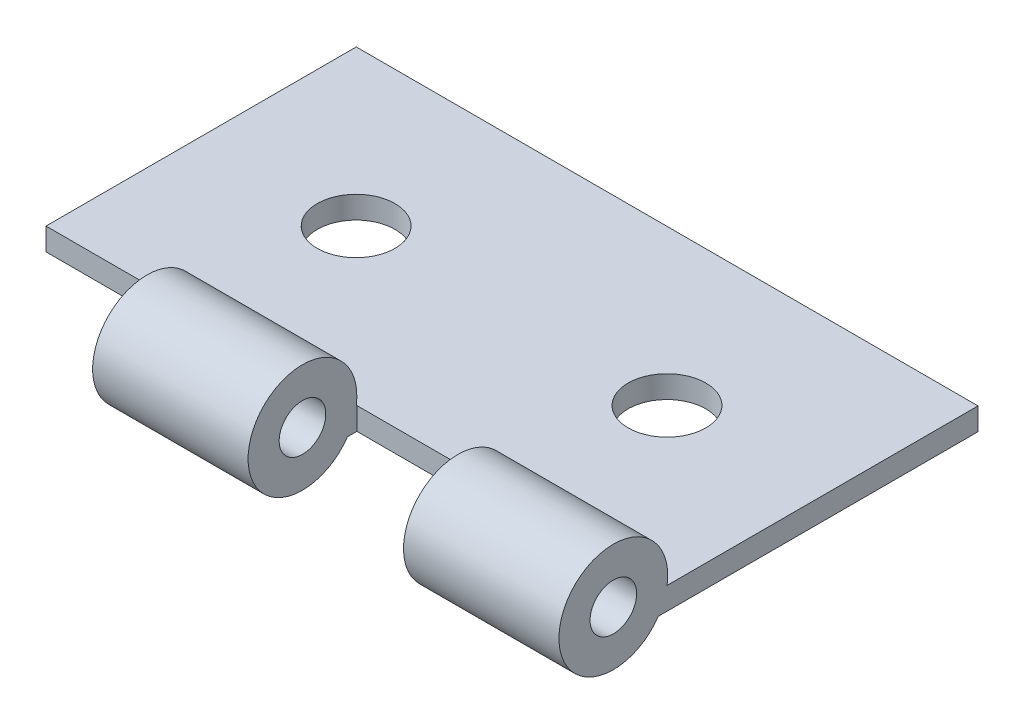
ISO-10303-21;
HEADER;
FILE_DESCRIPTION(('STEP AP214'),'2;1');
FILE_NAME('part.step','',(''),(''),'','','');
FILE_SCHEMA(('AUTOMOTIVE_DESIGN { 1 0 10303 214 1 1 1 1 }'));
ENDSEC;
DATA;
#1=APPLICATION_CONTEXT('core data for automotive mechanical design processes');
#2=APPLICATION_PROTOCOL_DEFINITION('international standard','automotive_design',2000,#1);
#3=PRODUCT_CONTEXT('',#1,'mechanical');
#4=PRODUCT('Part','Part','',(#3));
#5=PRODUCT_RELATED_PRODUCT_CATEGORY('part','',(#4));
#6=PRODUCT_DEFINITION_FORMATION('','',#4);
#7=PRODUCT_DEFINITION_CONTEXT('part definition',#1,'design');
#8=PRODUCT_DEFINITION('design','',#6,#7);
#9=PRODUCT_DEFINITION_SHAPE('','',#8);
#10=(LENGTH_UNIT() NAMED_UNIT(*) SI_UNIT(.MILLI.,.METRE.));
#11=(NAMED_UNIT(*) PLANE_ANGLE_UNIT() SI_UNIT($,.RADIAN.));
#12=(NAMED_UNIT(*) SI_UNIT($,.STERADIAN.) SOLID_ANGLE_UNIT());
#13=UNCERTAINTY_MEASURE_WITH_UNIT(LENGTH_MEASURE(1.E-05),#10,'distance_accuracy_value','');
#14=(GEOMETRIC_REPRESENTATION_CONTEXT(3) GLOBAL_UNCERTAINTY_ASSIGNED_CONTEXT((#13)) GLOBAL_UNIT_ASSIGNED_CONTEXT((#10,
#11,#12)) REPRESENTATION_CONTEXT('',''));
#15=CARTESIAN_POINT('',(0.,0.,0.));
#16=DIRECTION('',(0.,0.,1.));
#17=DIRECTION('',(1.,0.,0.));
#18=AXIS2_PLACEMENT_3D('',#15,#16,#17);
#19=CARTESIAN_POINT('',(50.8,0.,0.));
#20=DIRECTION('',(-1.,0.,0.));
#21=DIRECTION('',(0.,0.,1.));
#22=AXIS2_PLACEMENT_3D('',#19,#20,#21);
#23=CYLINDRICAL_SURFACE('',#22,4.445);
#24=DIRECTION('',(-1.,0.,0.));
#25=VECTOR('',#24,1.);
#26=CARTESIAN_POINT('',(50.8,-0.670981472408734,-4.39406518655381));
#27=LINE('',#26,#25);
#28=CARTESIAN_POINT('',(25.4,-0.670981472408734,-4.39406518655381));
#29=VERTEX_POINT('',#28);
#30=CARTESIAN_POINT('',(12.7,-0.670981472408734,-4.39406518655381));
#31=VERTEX_POINT('',#30);
#32=EDGE_CURVE('E155',#29,#31,#27,.T.);
#33=ORIENTED_EDGE('',*,*,#32,.T.);
#34=CARTESIAN_POINT('',(12.7,0.,0.));
#35=DIRECTION('',(1.,0.,0.));
#36=DIRECTION('',(0.,0.,-1.));
#37=AXIS2_PLACEMENT_3D('',#34,#35,#36);
#38=CIRCLE('',#37,4.445);
#39=CARTESIAN_POINT('',(12.7,-2.49978147240873,-3.67547515162353));
#40=VERTEX_POINT('',#39);
#41=EDGE_CURVE('E133',#31,#40,#38,.T.);
#42=ORIENTED_EDGE('',*,*,#41,.T.);
#43=DIRECTION('',(-1.,0.,0.));
#44=VECTOR('',#43,1.);
#45=CARTESIAN_POINT('',(50.8,-2.49978147240873,-3.67547515162353));
#46=LINE('',#45,#44);
#47=CARTESIAN_POINT('',(25.4,-2.49978147240873,-3.67547515162353));
#48=VERTEX_POINT('',#47);
#49=EDGE_CURVE('E131',#48,#40,#46,.T.);
#50=ORIENTED_EDGE('',*,*,#49,.F.);
#51=CARTESIAN_POINT('',(25.4,0.,0.));
#52=DIRECTION('',(-1.,0.,0.));
#53=DIRECTION('',(0.,0.,1.));
#54=AXIS2_PLACEMENT_3D('',#51,#52,#53);
#55=CIRCLE('',#54,4.445);
#56=EDGE_CURVE('E325',#48,#29,#55,.T.);
#57=ORIENTED_EDGE('',*,*,#56,.T.);
#58=EDGE_LOOP('',(#33,#42,#50,#57));
#59=FACE_BOUND('',#58,.T.);
#60=ADVANCED_FACE('F35',(#59),#23,.T.);
#61=CARTESIAN_POINT('',(50.8,0.,0.));
#62=DIRECTION('',(-1.,0.,0.));
#63=DIRECTION('',(0.,0.,1.));
#64=AXIS2_PLACEMENT_3D('',#61,#62,#63);
#65=CYLINDRICAL_SURFACE('',#64,1.905);
#66=CARTESIAN_POINT('',(38.1,0.,0.));
#67=DIRECTION('',(1.,0.,0.));
#68=DIRECTION('',(0.,0.,-1.));
#69=AXIS2_PLACEMENT_3D('',#66,#67,#68);
#70=CIRCLE('',#69,1.905);
#71=CARTESIAN_POINT('',(38.1,0.,-1.905));
#72=VERTEX_POINT('',#71);
#73=EDGE_CURVE('E138',#72,#72,#70,.T.);
#74=ORIENTED_EDGE('',*,*,#73,.F.);
#75=EDGE_LOOP('',(#74));
#76=FACE_BOUND('',#75,.T.);
#77=CARTESIAN_POINT('',(50.8,0.,0.));
#78=DIRECTION('',(1.,0.,0.));
#79=DIRECTION('',(0.,0.,-1.));
#80=AXIS2_PLACEMENT_3D('',#77,#78,#79);
#81=CIRCLE('',#80,1.905);
#82=CARTESIAN_POINT('',(50.8,0.,-1.905));
#83=VERTEX_POINT('',#82);
#84=EDGE_CURVE('E142',#83,#83,#81,.T.);
#85=ORIENTED_EDGE('',*,*,#84,.T.);
#86=EDGE_LOOP('',(#85));
#87=FACE_BOUND('',#86,.T.);
#88=ADVANCED_FACE('F213',(#76,#87),#65,.F.);
#89=CARTESIAN_POINT('',(50.8,-0.670981472408734,-4.39406518655381));
#90=VERTEX_POINT('',#89);
#91=CARTESIAN_POINT('',(38.1,-0.670981472408734,-4.39406518655381));
#92=VERTEX_POINT('',#91);
#93=EDGE_CURVE('E161',#90,#92,#27,.T.);
#94=ORIENTED_EDGE('',*,*,#93,.T.);
#95=CARTESIAN_POINT('',(38.1,0.,0.));
#96=DIRECTION('',(1.,0.,0.));
#97=DIRECTION('',(0.,0.,-1.));
#98=AXIS2_PLACEMENT_3D('',#95,#96,#97);
#99=CIRCLE('',#98,4.445);
#100=CARTESIAN_POINT('',(38.1,-2.49978147240873,-3.67547515162353));
#101=VERTEX_POINT('',#100);
#102=EDGE_CURVE('E190',#92,#101,#99,.T.);
#103=ORIENTED_EDGE('',*,*,#102,.T.);
#104=CARTESIAN_POINT('',(50.8,-2.49978147240873,-3.67547515162353));
#105=VERTEX_POINT('',#104);
#106=EDGE_CURVE('E170',#105,#101,#46,.T.);
#107=ORIENTED_EDGE('',*,*,#106,.F.);
#108=CARTESIAN_POINT('',(50.8,0.,0.));
#109=DIRECTION('',(1.,0.,0.));
#110=DIRECTION('',(0.,0.,-1.));
#111=AXIS2_PLACEMENT_3D('',#108,#109,#110);
#112=CIRCLE('',#111,4.445);
#113=EDGE_CURVE('E145',#90,#105,#112,.T.);
#114=ORIENTED_EDGE('',*,*,#113,.F.);
#115=EDGE_LOOP('',(#94,#103,#107,#114));
#116=FACE_BOUND('',#115,.T.);
#117=ADVANCED_FACE('F188',(#116),#23,.T.);
#118=CARTESIAN_POINT('',(50.8,-2.49978147240873,0.));
#119=DIRECTION('',(0.,1.,0.));
#120=DIRECTION('',(0.,0.,1.));
#121=AXIS2_PLACEMENT_3D('',#118,#119,#120);
#122=PLANE('',#121);
#123=CARTESIAN_POINT('',(12.6633298013245,-2.49978147240873,-17.1195325932769));
#124=DIRECTION('',(0.,1.,0.));
#125=DIRECTION('',(0.,0.,1.));
#126=AXIS2_PLACEMENT_3D('',#123,#124,#125);
#127=CIRCLE('',#126,3.175);
#128=CARTESIAN_POINT('',(12.6633298013245,-2.49978147240873,-13.9445325932769));
#129=VERTEX_POINT('',#128);
#130=EDGE_CURVE('E340',#129,#129,#127,.T.);
#131=ORIENTED_EDGE('',*,*,#130,.T.);
#132=EDGE_LOOP('',(#131));
#133=FACE_BOUND('',#132,.T.);
#134=CARTESIAN_POINT('',(38.0633298013245,-2.49978147240873,-17.1195325932769));
#135=DIRECTION('',(0.,1.,0.));
#136=DIRECTION('',(0.,0.,1.));
#137=AXIS2_PLACEMENT_3D('',#134,#135,#136);
#138=CIRCLE('',#137,3.175);
#139=CARTESIAN_POINT('',(38.0633298013245,-2.49978147240873,-13.9445325932769));
#140=VERTEX_POINT('',#139);
#141=EDGE_CURVE('E345',#140,#140,#138,.T.);
#142=ORIENTED_EDGE('',*,*,#141,.T.);
#143=EDGE_LOOP('',(#142));
#144=FACE_BOUND('',#143,.T.);
#145=DIRECTION('',(0.,0.,-1.));
#146=VECTOR('',#145,1.);
#147=CARTESIAN_POINT('',(12.7,-2.49978147240873,0.));
#148=LINE('',#147,#146);
#149=CARTESIAN_POINT('',(12.7,-2.49978147240873,-4.445));
#150=VERTEX_POINT('',#149);
#151=EDGE_CURVE('E123',#40,#150,#148,.T.);
#152=ORIENTED_EDGE('',*,*,#151,.T.);
#153=DIRECTION('',(-1.,0.,0.));
#154=VECTOR('',#153,1.);
#155=CARTESIAN_POINT('',(50.8,-2.49978147240873,-4.445));
#156=LINE('',#155,#154);
#157=CARTESIAN_POINT('',(0.,-2.49978147240873,-4.445));
#158=VERTEX_POINT('',#157);
#159=EDGE_CURVE('E111',#150,#158,#156,.T.);
#160=ORIENTED_EDGE('',*,*,#159,.T.);
#161=DIRECTION('',(0.,0.,-1.));
#162=VECTOR('',#161,1.);
#163=CARTESIAN_POINT('',(0.,-2.49978147240873,0.));
#164=LINE('',#163,#162);
#165=CARTESIAN_POINT('',(0.,-2.49978147240873,-29.7940651865538));
#166=VERTEX_POINT('',#165);
#167=EDGE_CURVE('E136',#158,#166,#164,.T.);
#168=ORIENTED_EDGE('',*,*,#167,.T.);
#169=DIRECTION('',(-1.,0.,0.));
#170=VECTOR('',#169,1.);
#171=CARTESIAN_POINT('',(50.8,-2.49978147240873,-29.7940651865538));
#172=LINE('',#171,#170);
#173=CARTESIAN_POINT('',(50.8,-2.49978147240873,-29.7940651865538));
#174=VERTEX_POINT('',#173);
#175=EDGE_CURVE('E167',#174,#166,#172,.T.);
#176=ORIENTED_EDGE('',*,*,#175,.F.);
#177=DIRECTION('',(0.,0.,-1.));
#178=VECTOR('',#177,1.);
#179=CARTESIAN_POINT('',(50.8,-2.49978147240873,0.));
#180=LINE('',#179,#178);
#181=EDGE_CURVE('E149',#105,#174,#180,.T.);
#182=ORIENTED_EDGE('',*,*,#181,.F.);
#183=ORIENTED_EDGE('',*,*,#106,.T.);
#184=DIRECTION('',(0.,0.,-1.));
#185=VECTOR('',#184,1.);
#186=CARTESIAN_POINT('',(38.1,-2.49978147240873,0.));
#187=LINE('',#186,#185);
#188=CARTESIAN_POINT('',(38.1,-2.49978147240873,-4.445));
#189=VERTEX_POINT('',#188);
#190=EDGE_CURVE('E323',#101,#189,#187,.T.);
#191=ORIENTED_EDGE('',*,*,#190,.T.);
#192=DIRECTION('',(-1.,0.,0.));
#193=VECTOR('',#192,1.);
#194=CARTESIAN_POINT('',(50.8,-2.49978147240873,-4.445));
#195=LINE('',#194,#193);
#196=CARTESIAN_POINT('',(25.4,-2.49978147240873,-4.445));
#197=VERTEX_POINT('',#196);
#198=EDGE_CURVE('E119',#189,#197,#195,.T.);
#199=ORIENTED_EDGE('',*,*,#198,.T.);
#200=DIRECTION('',(0.,0.,1.));
#201=VECTOR('',#200,1.);
#202=CARTESIAN_POINT('',(25.4,-2.49978147240873,0.));
#203=LINE('',#202,#201);
#204=EDGE_CURVE('E321',#197,#48,#203,.T.);
#205=ORIENTED_EDGE('',*,*,#204,.T.);
#206=ORIENTED_EDGE('',*,*,#49,.T.);
#207=EDGE_LOOP('',(#152,#160,#168,#176,#182,#183,#191,#199,#205,#206));
#208=FACE_BOUND('',#207,.T.);
#209=ADVANCED_FACE('F128',(#133,#144,#208),#122,.F.);
#210=CARTESIAN_POINT('',(50.8,0.,-29.7940651865538));
#211=DIRECTION('',(0.,0.,1.));
#212=DIRECTION('',(1.,0.,0.));
#213=AXIS2_PLACEMENT_3D('',#210,#211,#212);
#214=PLANE('',#213);
#215=DIRECTION('',(0.,1.,0.));
#216=VECTOR('',#215,1.);
#217=CARTESIAN_POINT('',(0.,0.,-29.7940651865538));
#218=LINE('',#217,#216);
#219=CARTESIAN_POINT('',(0.,-0.670981472408731,-29.7940651865538));
#220=VERTEX_POINT('',#219);
#221=EDGE_CURVE('E157',#166,#220,#218,.T.);
#222=ORIENTED_EDGE('',*,*,#221,.T.);
#223=DIRECTION('',(-1.,0.,0.));
#224=VECTOR('',#223,1.);
#225=CARTESIAN_POINT('',(50.8,-0.670981472408731,-29.7940651865538));
#226=LINE('',#225,#224);
#227=CARTESIAN_POINT('',(50.8,-0.670981472408731,-29.7940651865538));
#228=VERTEX_POINT('',#227);
#229=EDGE_CURVE('E164',#228,#220,#226,.T.);
#230=ORIENTED_EDGE('',*,*,#229,.F.);
#231=DIRECTION('',(0.,1.,0.));
#232=VECTOR('',#231,1.);
#233=CARTESIAN_POINT('',(50.8,0.,-29.7940651865538));
#234=LINE('',#233,#232);
#235=EDGE_CURVE('E151',#174,#228,#234,.T.);
#236=ORIENTED_EDGE('',*,*,#235,.F.);
#237=ORIENTED_EDGE('',*,*,#175,.T.);
#238=EDGE_LOOP('',(#222,#230,#236,#237));
#239=FACE_BOUND('',#238,.T.);
#240=ADVANCED_FACE('F201',(#239),#214,.F.);
#241=CARTESIAN_POINT('',(50.8,-0.670981472408734,0.));
#242=DIRECTION('',(0.,-1.,0.));
#243=DIRECTION('',(0.,0.,-1.));
#244=AXIS2_PLACEMENT_3D('',#241,#242,#243);
#245=PLANE('',#244);
#246=CARTESIAN_POINT('',(12.6633298013245,-0.670981472408732,-17.1195325932769));
#247=DIRECTION('',(0.,1.,0.));
#248=DIRECTION('',(0.,0.,1.));
#249=AXIS2_PLACEMENT_3D('',#246,#247,#248);
#250=CIRCLE('',#249,3.175);
#251=CARTESIAN_POINT('',(12.6633298013245,-0.670981472408733,-13.9445325932769));
#252=VERTEX_POINT('',#251);
#253=EDGE_CURVE('E348',#252,#252,#250,.T.);
#254=ORIENTED_EDGE('',*,*,#253,.F.);
#255=EDGE_LOOP('',(#254));
#256=FACE_BOUND('',#255,.T.);
#257=CARTESIAN_POINT('',(38.0633298013245,-0.670981472408732,-17.1195325932769));
#258=DIRECTION('',(0.,1.,0.));
#259=DIRECTION('',(0.,0.,-1.));
#260=AXIS2_PLACEMENT_3D('',#257,#258,#259);
#261=CIRCLE('',#260,3.175);
#262=CARTESIAN_POINT('',(38.0633298013245,-0.670981472408732,-20.2945325932769));
#263=VERTEX_POINT('',#262);
#264=EDGE_CURVE('E349',#263,#263,#261,.T.);
#265=ORIENTED_EDGE('',*,*,#264,.F.);
#266=EDGE_LOOP('',(#265));
#267=FACE_BOUND('',#266,.T.);
#268=DIRECTION('',(0.,0.,1.));
#269=VECTOR('',#268,1.);
#270=CARTESIAN_POINT('',(0.,-0.670981472408734,0.));
#271=LINE('',#270,#269);
#272=CARTESIAN_POINT('',(0.,-0.670981472408734,-4.445));
#273=VERTEX_POINT('',#272);
#274=EDGE_CURVE('E146',#220,#273,#271,.T.);
#275=ORIENTED_EDGE('',*,*,#274,.T.);
#276=DIRECTION('',(1.,0.,0.));
#277=VECTOR('',#276,1.);
#278=CARTESIAN_POINT('',(50.8,-0.670981472408734,-4.445));
#279=LINE('',#278,#277);
#280=CARTESIAN_POINT('',(12.7,-0.670981472408734,-4.445));
#281=VERTEX_POINT('',#280);
#282=EDGE_CURVE('E58',#273,#281,#279,.T.);
#283=ORIENTED_EDGE('',*,*,#282,.T.);
#284=DIRECTION('',(0.,0.,1.));
#285=VECTOR('',#284,1.);
#286=CARTESIAN_POINT('',(12.7,-0.670981472408734,0.));
#287=LINE('',#286,#285);
#288=EDGE_CURVE('E11',#281,#31,#287,.T.);
#289=ORIENTED_EDGE('',*,*,#288,.T.);
#290=ORIENTED_EDGE('',*,*,#32,.F.);
#291=DIRECTION('',(0.,0.,-1.));
#292=VECTOR('',#291,1.);
#293=CARTESIAN_POINT('',(25.4,-0.670981472408734,0.));
#294=LINE('',#293,#292);
#295=CARTESIAN_POINT('',(25.4,-0.670981472408734,-4.445));
#296=VERTEX_POINT('',#295);
#297=EDGE_CURVE('E177',#29,#296,#294,.T.);
#298=ORIENTED_EDGE('',*,*,#297,.T.);
#299=DIRECTION('',(1.,0.,0.));
#300=VECTOR('',#299,1.);
#301=CARTESIAN_POINT('',(50.8,-0.670981472408734,-4.445));
#302=LINE('',#301,#300);
#303=CARTESIAN_POINT('',(38.1,-0.670981472408734,-4.445));
#304=VERTEX_POINT('',#303);
#305=EDGE_CURVE('E174',#296,#304,#302,.T.);
#306=ORIENTED_EDGE('',*,*,#305,.T.);
#307=DIRECTION('',(0.,0.,1.));
#308=VECTOR('',#307,1.);
#309=CARTESIAN_POINT('',(38.1,-0.670981472408734,0.));
#310=LINE('',#309,#308);
#311=EDGE_CURVE('E43',#304,#92,#310,.T.);
#312=ORIENTED_EDGE('',*,*,#311,.T.);
#313=ORIENTED_EDGE('',*,*,#93,.F.);
#314=DIRECTION('',(0.,0.,1.));
#315=VECTOR('',#314,1.);
#316=CARTESIAN_POINT('',(50.8,-0.670981472408734,0.));
#317=LINE('',#316,#315);
#318=EDGE_CURVE('E153',#228,#90,#317,.T.);
#319=ORIENTED_EDGE('',*,*,#318,.F.);
#320=ORIENTED_EDGE('',*,*,#229,.T.);
#321=EDGE_LOOP('',(#275,#283,#289,#290,#298,#306,#312,#313,#319,#320));
#322=FACE_BOUND('',#321,.T.);
#323=ADVANCED_FACE('F182',(#256,#267,#322),#245,.F.);
#324=CARTESIAN_POINT('',(50.8,0.,0.));
#325=DIRECTION('',(1.,0.,0.));
#326=DIRECTION('',(0.,0.,-1.));
#327=AXIS2_PLACEMENT_3D('',#324,#325,#326);
#328=PLANE('',#327);
#329=ORIENTED_EDGE('',*,*,#84,.F.);
#330=EDGE_LOOP('',(#329));
#331=FACE_BOUND('',#330,.T.);
#332=ORIENTED_EDGE('',*,*,#113,.T.);
#333=ORIENTED_EDGE('',*,*,#181,.T.);
#334=ORIENTED_EDGE('',*,*,#235,.T.);
#335=ORIENTED_EDGE('',*,*,#318,.T.);
#336=EDGE_LOOP('',(#332,#333,#334,#335));
#337=FACE_BOUND('',#336,.T.);
#338=ADVANCED_FACE('F192',(#331,#337),#328,.T.);
#339=CARTESIAN_POINT('',(0.,0.,0.));
#340=DIRECTION('',(1.,0.,0.));
#341=DIRECTION('',(0.,0.,-1.));
#342=AXIS2_PLACEMENT_3D('',#339,#340,#341);
#343=PLANE('',#342);
#344=ORIENTED_EDGE('',*,*,#167,.F.);
#345=DIRECTION('',(0.,1.,0.));
#346=VECTOR('',#345,1.);
#347=CARTESIAN_POINT('',(0.,0.,-4.445));
#348=LINE('',#347,#346);
#349=EDGE_CURVE('E115',#158,#273,#348,.T.);
#350=ORIENTED_EDGE('',*,*,#349,.T.);
#351=ORIENTED_EDGE('',*,*,#274,.F.);
#352=ORIENTED_EDGE('',*,*,#221,.F.);
#353=EDGE_LOOP('',(#344,#350,#351,#352));
#354=FACE_BOUND('',#353,.T.);
#355=ADVANCED_FACE('F200',(#354),#343,.F.);
#356=CARTESIAN_POINT('',(12.7,-4.445,-4.445));
#357=DIRECTION('',(1.,0.,0.));
#358=DIRECTION('',(0.,0.,-1.));
#359=AXIS2_PLACEMENT_3D('',#356,#357,#358);
#360=PLANE('',#359);
#361=CARTESIAN_POINT('',(12.7,0.,0.));
#362=DIRECTION('',(1.,0.,0.));
#363=DIRECTION('',(0.,0.,-1.));
#364=AXIS2_PLACEMENT_3D('',#361,#362,#363);
#365=CIRCLE('',#364,1.905);
#366=CARTESIAN_POINT('',(12.7,0.,-1.905));
#367=VERTEX_POINT('',#366);
#368=EDGE_CURVE('E132',#367,#367,#365,.T.);
#369=ORIENTED_EDGE('',*,*,#368,.T.);
#370=EDGE_LOOP('',(#369));
#371=FACE_BOUND('',#370,.T.);
#372=ORIENTED_EDGE('',*,*,#41,.F.);
#373=ORIENTED_EDGE('',*,*,#288,.F.);
#374=DIRECTION('',(0.,1.,0.));
#375=VECTOR('',#374,1.);
#376=CARTESIAN_POINT('',(12.7,-4.445,-4.445));
#377=LINE('',#376,#375);
#378=EDGE_CURVE('E114',#150,#281,#377,.T.);
#379=ORIENTED_EDGE('',*,*,#378,.F.);
#380=ORIENTED_EDGE('',*,*,#151,.F.);
#381=EDGE_LOOP('',(#372,#373,#379,#380));
#382=FACE_BOUND('',#381,.T.);
#383=ADVANCED_FACE('F122',(#371,#382),#360,.F.);
#384=CARTESIAN_POINT('',(0.,-4.445,-4.445));
#385=DIRECTION('',(0.,0.,-1.));
#386=DIRECTION('',(0.,1.,0.));
#387=AXIS2_PLACEMENT_3D('',#384,#385,#386);
#388=PLANE('',#387);
#389=ORIENTED_EDGE('',*,*,#378,.T.);
#390=ORIENTED_EDGE('',*,*,#282,.F.);
#391=ORIENTED_EDGE('',*,*,#349,.F.);
#392=ORIENTED_EDGE('',*,*,#159,.F.);
#393=EDGE_LOOP('',(#389,#390,#391,#392));
#394=FACE_BOUND('',#393,.T.);
#395=ADVANCED_FACE('F113',(#394),#388,.F.);
#396=CARTESIAN_POINT('',(38.1,-4.445,-4.445));
#397=DIRECTION('',(1.,0.,0.));
#398=DIRECTION('',(0.,0.,-1.));
#399=AXIS2_PLACEMENT_3D('',#396,#397,#398);
#400=PLANE('',#399);
#401=ORIENTED_EDGE('',*,*,#73,.T.);
#402=EDGE_LOOP('',(#401));
#403=FACE_BOUND('',#402,.T.);
#404=ORIENTED_EDGE('',*,*,#102,.F.);
#405=ORIENTED_EDGE('',*,*,#311,.F.);
#406=DIRECTION('',(0.,1.,0.));
#407=VECTOR('',#406,1.);
#408=CARTESIAN_POINT('',(38.1,-4.445,-4.445));
#409=LINE('',#408,#407);
#410=EDGE_CURVE('E50',#189,#304,#409,.T.);
#411=ORIENTED_EDGE('',*,*,#410,.F.);
#412=ORIENTED_EDGE('',*,*,#190,.F.);
#413=EDGE_LOOP('',(#404,#405,#411,#412));
#414=FACE_BOUND('',#413,.T.);
#415=ADVANCED_FACE('F274',(#403,#414),#400,.F.);
#416=CARTESIAN_POINT('',(25.4,-4.445,-4.445));
#417=DIRECTION('',(-1.,0.,0.));
#418=DIRECTION('',(0.,0.,1.));
#419=AXIS2_PLACEMENT_3D('',#416,#417,#418);
#420=PLANE('',#419);
#421=CARTESIAN_POINT('',(25.4,0.,0.));
#422=DIRECTION('',(-1.,0.,0.));
#423=DIRECTION('',(0.,0.,1.));
#424=AXIS2_PLACEMENT_3D('',#421,#422,#423);
#425=CIRCLE('',#424,1.905);
#426=CARTESIAN_POINT('',(25.4,0.,1.905));
#427=VERTEX_POINT('',#426);
#428=EDGE_CURVE('E320',#427,#427,#425,.T.);
#429=ORIENTED_EDGE('',*,*,#428,.T.);
#430=EDGE_LOOP('',(#429));
#431=FACE_BOUND('',#430,.T.);
#432=DIRECTION('',(0.,1.,0.));
#433=VECTOR('',#432,1.);
#434=CARTESIAN_POINT('',(25.4,-4.445,-4.445));
#435=LINE('',#434,#433);
#436=EDGE_CURVE('E125',#197,#296,#435,.T.);
#437=ORIENTED_EDGE('',*,*,#436,.T.);
#438=ORIENTED_EDGE('',*,*,#297,.F.);
#439=ORIENTED_EDGE('',*,*,#56,.F.);
#440=ORIENTED_EDGE('',*,*,#204,.F.);
#441=EDGE_LOOP('',(#437,#438,#439,#440));
#442=FACE_BOUND('',#441,.T.);
#443=ADVANCED_FACE('F278',(#431,#442),#420,.F.);
#444=CARTESIAN_POINT('',(25.4,-4.445,-4.445));
#445=DIRECTION('',(0.,0.,-1.));
#446=DIRECTION('',(-1.,0.,0.));
#447=AXIS2_PLACEMENT_3D('',#444,#445,#446);
#448=PLANE('',#447);
#449=ORIENTED_EDGE('',*,*,#410,.T.);
#450=ORIENTED_EDGE('',*,*,#305,.F.);
#451=ORIENTED_EDGE('',*,*,#436,.F.);
#452=ORIENTED_EDGE('',*,*,#198,.F.);
#453=EDGE_LOOP('',(#449,#450,#451,#452));
#454=FACE_BOUND('',#453,.T.);
#455=ADVANCED_FACE('F281',(#454),#448,.F.);
#456=ORIENTED_EDGE('',*,*,#368,.F.);
#457=EDGE_LOOP('',(#456));
#458=FACE_BOUND('',#457,.T.);
#459=ORIENTED_EDGE('',*,*,#428,.F.);
#460=EDGE_LOOP('',(#459));
#461=FACE_BOUND('',#460,.T.);
#462=ADVANCED_FACE('F37',(#458,#461),#65,.F.);
#463=CARTESIAN_POINT('',(38.0633298013245,-4.445,-17.1195325932769));
#464=DIRECTION('',(0.,1.,0.));
#465=DIRECTION('',(0.,0.,1.));
#466=AXIS2_PLACEMENT_3D('',#463,#464,#465);
#467=CYLINDRICAL_SURFACE('',#466,3.175);
#468=ORIENTED_EDGE('',*,*,#264,.T.);
#469=EDGE_LOOP('',(#468));
#470=FACE_BOUND('',#469,.T.);
#471=ORIENTED_EDGE('',*,*,#141,.F.);
#472=EDGE_LOOP('',(#471));
#473=FACE_BOUND('',#472,.T.);
#474=ADVANCED_FACE('F249',(#470,#473),#467,.F.);
#475=CARTESIAN_POINT('',(12.6633298013245,-4.445,-17.1195325932769));
#476=DIRECTION('',(0.,1.,0.));
#477=DIRECTION('',(0.,0.,1.));
#478=AXIS2_PLACEMENT_3D('',#475,#476,#477);
#479=CYLINDRICAL_SURFACE('',#478,3.175);
#480=ORIENTED_EDGE('',*,*,#253,.T.);
#481=EDGE_LOOP('',(#480));
#482=FACE_BOUND('',#481,.T.);
#483=ORIENTED_EDGE('',*,*,#130,.F.);
#484=EDGE_LOOP('',(#483));
#485=FACE_BOUND('',#484,.T.);
#486=ADVANCED_FACE('F254',(#482,#485),#479,.F.);
#487=CLOSED_SHELL('',(#60,#88,#117,#209,#240,#323,#338,#355,#383,#395,#415,#443,#455,#462,#474,#486));
#488=MANIFOLD_SOLID_BREP('B2',#487);
#489=ADVANCED_BREP_SHAPE_REPRESENTATION('',(#18,#488),#14);
#490=SHAPE_DEFINITION_REPRESENTATION(#9,#489);
ENDSEC;
END-ISO-10303-21;
